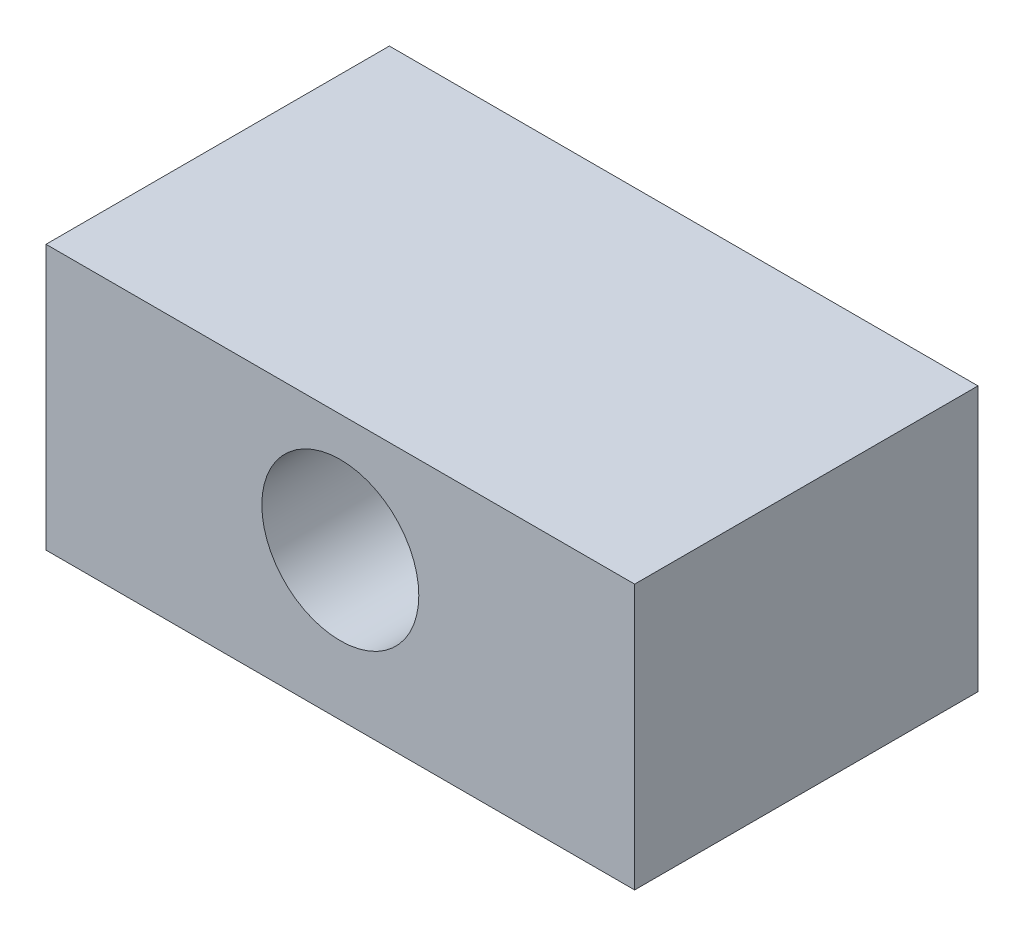
ISO-10303-21;
HEADER;
FILE_DESCRIPTION(('STEP AP214'),'2;1');
FILE_NAME('part.step','',(''),(''),'','','');
FILE_SCHEMA(('AUTOMOTIVE_DESIGN { 1 0 10303 214 1 1 1 1 }'));
ENDSEC;
DATA;
#1=APPLICATION_CONTEXT('core data for automotive mechanical design processes');
#2=APPLICATION_PROTOCOL_DEFINITION('international standard','automotive_design',2000,#1);
#3=PRODUCT_CONTEXT('',#1,'mechanical');
#4=PRODUCT('Part','Part','',(#3));
#5=PRODUCT_RELATED_PRODUCT_CATEGORY('part','',(#4));
#6=PRODUCT_DEFINITION_FORMATION('','',#4);
#7=PRODUCT_DEFINITION_CONTEXT('part definition',#1,'design');
#8=PRODUCT_DEFINITION('design','',#6,#7);
#9=PRODUCT_DEFINITION_SHAPE('','',#8);
#10=(LENGTH_UNIT() NAMED_UNIT(*) SI_UNIT(.MILLI.,.METRE.));
#11=(NAMED_UNIT(*) PLANE_ANGLE_UNIT() SI_UNIT($,.RADIAN.));
#12=(NAMED_UNIT(*) SI_UNIT($,.STERADIAN.) SOLID_ANGLE_UNIT());
#13=UNCERTAINTY_MEASURE_WITH_UNIT(LENGTH_MEASURE(1.E-05),#10,'distance_accuracy_value','');
#14=(GEOMETRIC_REPRESENTATION_CONTEXT(3) GLOBAL_UNCERTAINTY_ASSIGNED_CONTEXT((#13)) GLOBAL_UNIT_ASSIGNED_CONTEXT((#10,
#11,#12)) REPRESENTATION_CONTEXT('',''));
#15=CARTESIAN_POINT('',(0.,0.,0.));
#16=DIRECTION('',(0.,0.,1.));
#17=DIRECTION('',(1.,0.,0.));
#18=AXIS2_PLACEMENT_3D('',#15,#16,#17);
#19=CARTESIAN_POINT('',(0.,3.81,0.));
#20=DIRECTION('',(0.,1.,0.));
#21=DIRECTION('',(0.,0.,1.));
#22=AXIS2_PLACEMENT_3D('',#19,#20,#21);
#23=PLANE('',#22);
#24=DIRECTION('',(0.,0.,1.));
#25=VECTOR('',#24,1.);
#26=CARTESIAN_POINT('',(38.1,3.81,-22.225));
#27=LINE('',#26,#25);
#28=CARTESIAN_POINT('',(38.1,3.81,-22.225));
#29=VERTEX_POINT('',#28);
#30=CARTESIAN_POINT('',(38.1,3.81,22.225));
#31=VERTEX_POINT('',#30);
#32=EDGE_CURVE('E151',#29,#31,#27,.T.);
#33=ORIENTED_EDGE('',*,*,#32,.T.);
#34=DIRECTION('',(-1.,0.,0.));
#35=VECTOR('',#34,1.);
#36=CARTESIAN_POINT('',(-38.1,3.81,22.225));
#37=LINE('',#36,#35);
#38=CARTESIAN_POINT('',(-38.1,3.81,22.225));
#39=VERTEX_POINT('',#38);
#40=EDGE_CURVE('E164',#31,#39,#37,.T.);
#41=ORIENTED_EDGE('',*,*,#40,.T.);
#42=DIRECTION('',(0.,0.,-1.));
#43=VECTOR('',#42,1.);
#44=CARTESIAN_POINT('',(-38.1,3.81,-22.225));
#45=LINE('',#44,#43);
#46=CARTESIAN_POINT('',(-38.1,3.81,-22.225));
#47=VERTEX_POINT('',#46);
#48=EDGE_CURVE('E167',#39,#47,#45,.T.);
#49=ORIENTED_EDGE('',*,*,#48,.T.);
#50=DIRECTION('',(1.,0.,0.));
#51=VECTOR('',#50,1.);
#52=CARTESIAN_POINT('',(-38.1,3.81,-22.225));
#53=LINE('',#52,#51);
#54=EDGE_CURVE('E155',#47,#29,#53,.T.);
#55=ORIENTED_EDGE('',*,*,#54,.T.);
#56=EDGE_LOOP('',(#33,#41,#49,#55));
#57=FACE_BOUND('',#56,.T.);
#58=DIRECTION('',(0.,0.,-1.));
#59=VECTOR('',#58,1.);
#60=CARTESIAN_POINT('',(-25.4,3.81,15.875));
#61=LINE('',#60,#59);
#62=CARTESIAN_POINT('',(-25.4,3.81,15.875));
#63=VERTEX_POINT('',#62);
#64=CARTESIAN_POINT('',(-25.4,3.81,-15.875));
#65=VERTEX_POINT('',#64);
#66=EDGE_CURVE('E115',#63,#65,#61,.T.);
#67=ORIENTED_EDGE('',*,*,#66,.F.);
#68=DIRECTION('',(-1.,0.,0.));
#69=VECTOR('',#68,1.);
#70=CARTESIAN_POINT('',(25.4,3.81,15.875));
#71=LINE('',#70,#69);
#72=CARTESIAN_POINT('',(25.4,3.81,15.875));
#73=VERTEX_POINT('',#72);
#74=EDGE_CURVE('E126',#73,#63,#71,.T.);
#75=ORIENTED_EDGE('',*,*,#74,.F.);
#76=DIRECTION('',(0.,0.,1.));
#77=VECTOR('',#76,1.);
#78=CARTESIAN_POINT('',(25.4,3.81,-15.875));
#79=LINE('',#78,#77);
#80=CARTESIAN_POINT('',(25.4,3.81,-15.875));
#81=VERTEX_POINT('',#80);
#82=EDGE_CURVE('E137',#81,#73,#79,.T.);
#83=ORIENTED_EDGE('',*,*,#82,.F.);
#84=DIRECTION('',(1.,0.,0.));
#85=VECTOR('',#84,1.);
#86=CARTESIAN_POINT('',(-25.4,3.81,-15.875));
#87=LINE('',#86,#85);
#88=EDGE_CURVE('E125',#65,#81,#87,.T.);
#89=ORIENTED_EDGE('',*,*,#88,.F.);
#90=EDGE_LOOP('',(#67,#75,#83,#89));
#91=FACE_BOUND('',#90,.T.);
#92=ADVANCED_FACE('F39',(#57,#91),#23,.F.);
#93=CARTESIAN_POINT('',(38.1,38.1,-22.225));
#94=DIRECTION('',(1.,0.,0.));
#95=DIRECTION('',(0.,0.,-1.));
#96=AXIS2_PLACEMENT_3D('',#93,#94,#95);
#97=PLANE('',#96);
#98=ORIENTED_EDGE('',*,*,#32,.F.);
#99=DIRECTION('',(0.,-1.,0.));
#100=VECTOR('',#99,1.);
#101=CARTESIAN_POINT('',(38.1,38.1,-22.225));
#102=LINE('',#101,#100);
#103=CARTESIAN_POINT('',(38.1,38.1,-22.225));
#104=VERTEX_POINT('',#103);
#105=EDGE_CURVE('E11',#104,#29,#102,.T.);
#106=ORIENTED_EDGE('',*,*,#105,.F.);
#107=DIRECTION('',(0.,0.,1.));
#108=VECTOR('',#107,1.);
#109=CARTESIAN_POINT('',(38.1,38.1,-22.225));
#110=LINE('',#109,#108);
#111=CARTESIAN_POINT('',(38.1,38.1,22.225));
#112=VERTEX_POINT('',#111);
#113=EDGE_CURVE('E152',#104,#112,#110,.T.);
#114=ORIENTED_EDGE('',*,*,#113,.T.);
#115=DIRECTION('',(0.,-1.,0.));
#116=VECTOR('',#115,1.);
#117=CARTESIAN_POINT('',(38.1,38.1,22.225));
#118=LINE('',#117,#116);
#119=EDGE_CURVE('E89',#112,#31,#118,.T.);
#120=ORIENTED_EDGE('',*,*,#119,.T.);
#121=EDGE_LOOP('',(#98,#106,#114,#120));
#122=FACE_BOUND('',#121,.T.);
#123=ADVANCED_FACE('F41',(#122),#97,.T.);
#124=CARTESIAN_POINT('',(-38.1,38.1,-22.225));
#125=DIRECTION('',(0.,0.,-1.));
#126=DIRECTION('',(-1.,0.,0.));
#127=AXIS2_PLACEMENT_3D('',#124,#125,#126);
#128=PLANE('',#127);
#129=CARTESIAN_POINT('',(0.,22.86,-22.225));
#130=DIRECTION('',(0.,0.,-1.));
#131=DIRECTION('',(-1.,0.,0.));
#132=AXIS2_PLACEMENT_3D('',#129,#130,#131);
#133=CIRCLE('',#132,10.16);
#134=CARTESIAN_POINT('',(-10.16,22.86,-22.225));
#135=VERTEX_POINT('',#134);
#136=EDGE_CURVE('E294',#135,#135,#133,.T.);
#137=ORIENTED_EDGE('',*,*,#136,.F.);
#138=EDGE_LOOP('',(#137));
#139=FACE_BOUND('',#138,.T.);
#140=ORIENTED_EDGE('',*,*,#54,.F.);
#141=DIRECTION('',(0.,-1.,0.));
#142=VECTOR('',#141,1.);
#143=CARTESIAN_POINT('',(-38.1,38.1,-22.225));
#144=LINE('',#143,#142);
#145=CARTESIAN_POINT('',(-38.1,38.1,-22.225));
#146=VERTEX_POINT('',#145);
#147=EDGE_CURVE('E48',#146,#47,#144,.T.);
#148=ORIENTED_EDGE('',*,*,#147,.F.);
#149=DIRECTION('',(1.,0.,0.));
#150=VECTOR('',#149,1.);
#151=CARTESIAN_POINT('',(-38.1,38.1,-22.225));
#152=LINE('',#151,#150);
#153=EDGE_CURVE('E160',#146,#104,#152,.T.);
#154=ORIENTED_EDGE('',*,*,#153,.T.);
#155=ORIENTED_EDGE('',*,*,#105,.T.);
#156=EDGE_LOOP('',(#140,#148,#154,#155));
#157=FACE_BOUND('',#156,.T.);
#158=ADVANCED_FACE('F177',(#139,#157),#128,.T.);
#159=CARTESIAN_POINT('',(-38.1,38.1,-22.225));
#160=DIRECTION('',(-1.,0.,0.));
#161=DIRECTION('',(0.,0.,1.));
#162=AXIS2_PLACEMENT_3D('',#159,#160,#161);
#163=PLANE('',#162);
#164=ORIENTED_EDGE('',*,*,#48,.F.);
#165=DIRECTION('',(0.,-1.,0.));
#166=VECTOR('',#165,1.);
#167=CARTESIAN_POINT('',(-38.1,38.1,22.225));
#168=LINE('',#167,#166);
#169=CARTESIAN_POINT('',(-38.1,38.1,22.225));
#170=VERTEX_POINT('',#169);
#171=EDGE_CURVE('E173',#170,#39,#168,.T.);
#172=ORIENTED_EDGE('',*,*,#171,.F.);
#173=DIRECTION('',(0.,0.,-1.));
#174=VECTOR('',#173,1.);
#175=CARTESIAN_POINT('',(-38.1,38.1,-22.225));
#176=LINE('',#175,#174);
#177=EDGE_CURVE('E157',#170,#146,#176,.T.);
#178=ORIENTED_EDGE('',*,*,#177,.T.);
#179=ORIENTED_EDGE('',*,*,#147,.T.);
#180=EDGE_LOOP('',(#164,#172,#178,#179));
#181=FACE_BOUND('',#180,.T.);
#182=ADVANCED_FACE('F181',(#181),#163,.T.);
#183=CARTESIAN_POINT('',(-38.1,38.1,22.225));
#184=DIRECTION('',(0.,0.,1.));
#185=DIRECTION('',(1.,0.,0.));
#186=AXIS2_PLACEMENT_3D('',#183,#184,#185);
#187=PLANE('',#186);
#188=CARTESIAN_POINT('',(0.,22.86,22.225));
#189=DIRECTION('',(0.,0.,1.));
#190=DIRECTION('',(1.,0.,0.));
#191=AXIS2_PLACEMENT_3D('',#188,#189,#190);
#192=CIRCLE('',#191,10.16);
#193=CARTESIAN_POINT('',(10.16,22.86,22.225));
#194=VERTEX_POINT('',#193);
#195=EDGE_CURVE('E43',#194,#194,#192,.T.);
#196=ORIENTED_EDGE('',*,*,#195,.F.);
#197=EDGE_LOOP('',(#196));
#198=FACE_BOUND('',#197,.T.);
#199=ORIENTED_EDGE('',*,*,#40,.F.);
#200=ORIENTED_EDGE('',*,*,#119,.F.);
#201=DIRECTION('',(-1.,0.,0.));
#202=VECTOR('',#201,1.);
#203=CARTESIAN_POINT('',(-38.1,38.1,22.225));
#204=LINE('',#203,#202);
#205=EDGE_CURVE('E154',#112,#170,#204,.T.);
#206=ORIENTED_EDGE('',*,*,#205,.T.);
#207=ORIENTED_EDGE('',*,*,#171,.T.);
#208=EDGE_LOOP('',(#199,#200,#206,#207));
#209=FACE_BOUND('',#208,.T.);
#210=ADVANCED_FACE('F174',(#198,#209),#187,.T.);
#211=CARTESIAN_POINT('',(0.,38.1,0.));
#212=DIRECTION('',(0.,1.,0.));
#213=DIRECTION('',(0.,0.,1.));
#214=AXIS2_PLACEMENT_3D('',#211,#212,#213);
#215=PLANE('',#214);
#216=ORIENTED_EDGE('',*,*,#113,.F.);
#217=ORIENTED_EDGE('',*,*,#153,.F.);
#218=ORIENTED_EDGE('',*,*,#177,.F.);
#219=ORIENTED_EDGE('',*,*,#205,.F.);
#220=EDGE_LOOP('',(#216,#217,#218,#219));
#221=FACE_BOUND('',#220,.T.);
#222=ADVANCED_FACE('F183',(#221),#215,.T.);
#223=CARTESIAN_POINT('',(0.,8.89,0.));
#224=DIRECTION('',(0.,1.,0.));
#225=DIRECTION('',(0.,0.,1.));
#226=AXIS2_PLACEMENT_3D('',#223,#224,#225);
#227=PLANE('',#226);
#228=DIRECTION('',(1.,0.,0.));
#229=VECTOR('',#228,1.);
#230=CARTESIAN_POINT('',(-25.4,8.89,15.875));
#231=LINE('',#230,#229);
#232=CARTESIAN_POINT('',(-25.4,8.89,15.875));
#233=VERTEX_POINT('',#232);
#234=CARTESIAN_POINT('',(25.4,8.89,15.875));
#235=VERTEX_POINT('',#234);
#236=EDGE_CURVE('E138',#233,#235,#231,.T.);
#237=ORIENTED_EDGE('',*,*,#236,.F.);
#238=DIRECTION('',(0.,0.,1.));
#239=VECTOR('',#238,1.);
#240=CARTESIAN_POINT('',(-25.4,8.89,-15.875));
#241=LINE('',#240,#239);
#242=CARTESIAN_POINT('',(-25.4,8.89,-15.875));
#243=VERTEX_POINT('',#242);
#244=EDGE_CURVE('E146',#243,#233,#241,.T.);
#245=ORIENTED_EDGE('',*,*,#244,.F.);
#246=DIRECTION('',(-1.,0.,0.));
#247=VECTOR('',#246,1.);
#248=CARTESIAN_POINT('',(25.4,8.89,-15.875));
#249=LINE('',#248,#247);
#250=CARTESIAN_POINT('',(25.4,8.89,-15.875));
#251=VERTEX_POINT('',#250);
#252=EDGE_CURVE('E133',#251,#243,#249,.T.);
#253=ORIENTED_EDGE('',*,*,#252,.F.);
#254=DIRECTION('',(0.,0.,-1.));
#255=VECTOR('',#254,1.);
#256=CARTESIAN_POINT('',(25.4,8.89,15.875));
#257=LINE('',#256,#255);
#258=EDGE_CURVE('E140',#235,#251,#257,.T.);
#259=ORIENTED_EDGE('',*,*,#258,.F.);
#260=EDGE_LOOP('',(#237,#245,#253,#259));
#261=FACE_BOUND('',#260,.T.);
#262=ADVANCED_FACE('F185',(#261),#227,.F.);
#263=CARTESIAN_POINT('',(-25.4,8.89,15.875));
#264=DIRECTION('',(0.,0.,-1.));
#265=DIRECTION('',(-1.,0.,0.));
#266=AXIS2_PLACEMENT_3D('',#263,#264,#265);
#267=PLANE('',#266);
#268=ORIENTED_EDGE('',*,*,#74,.T.);
#269=DIRECTION('',(0.,-1.,0.));
#270=VECTOR('',#269,1.);
#271=CARTESIAN_POINT('',(-25.4,8.89,15.875));
#272=LINE('',#271,#270);
#273=EDGE_CURVE('E121',#233,#63,#272,.T.);
#274=ORIENTED_EDGE('',*,*,#273,.F.);
#275=ORIENTED_EDGE('',*,*,#236,.T.);
#276=DIRECTION('',(0.,-1.,0.));
#277=VECTOR('',#276,1.);
#278=CARTESIAN_POINT('',(25.4,8.89,15.875));
#279=LINE('',#278,#277);
#280=EDGE_CURVE('E56',#235,#73,#279,.T.);
#281=ORIENTED_EDGE('',*,*,#280,.T.);
#282=EDGE_LOOP('',(#268,#274,#275,#281));
#283=FACE_BOUND('',#282,.T.);
#284=ADVANCED_FACE('F191',(#283),#267,.T.);
#285=CARTESIAN_POINT('',(25.4,8.89,15.875));
#286=DIRECTION('',(-1.,0.,0.));
#287=DIRECTION('',(0.,0.,1.));
#288=AXIS2_PLACEMENT_3D('',#285,#286,#287);
#289=PLANE('',#288);
#290=ORIENTED_EDGE('',*,*,#82,.T.);
#291=ORIENTED_EDGE('',*,*,#280,.F.);
#292=ORIENTED_EDGE('',*,*,#258,.T.);
#293=DIRECTION('',(0.,-1.,0.));
#294=VECTOR('',#293,1.);
#295=CARTESIAN_POINT('',(25.4,8.89,-15.875));
#296=LINE('',#295,#294);
#297=EDGE_CURVE('E134',#251,#81,#296,.T.);
#298=ORIENTED_EDGE('',*,*,#297,.T.);
#299=EDGE_LOOP('',(#290,#291,#292,#298));
#300=FACE_BOUND('',#299,.T.);
#301=ADVANCED_FACE('F242',(#300),#289,.T.);
#302=CARTESIAN_POINT('',(25.4,8.89,-15.875));
#303=DIRECTION('',(0.,0.,1.));
#304=DIRECTION('',(1.,0.,0.));
#305=AXIS2_PLACEMENT_3D('',#302,#303,#304);
#306=PLANE('',#305);
#307=ORIENTED_EDGE('',*,*,#88,.T.);
#308=ORIENTED_EDGE('',*,*,#297,.F.);
#309=ORIENTED_EDGE('',*,*,#252,.T.);
#310=DIRECTION('',(0.,-1.,0.));
#311=VECTOR('',#310,1.);
#312=CARTESIAN_POINT('',(-25.4,8.89,-15.875));
#313=LINE('',#312,#311);
#314=EDGE_CURVE('E118',#243,#65,#313,.T.);
#315=ORIENTED_EDGE('',*,*,#314,.T.);
#316=EDGE_LOOP('',(#307,#308,#309,#315));
#317=FACE_BOUND('',#316,.T.);
#318=ADVANCED_FACE('F129',(#317),#306,.T.);
#319=CARTESIAN_POINT('',(-25.4,8.89,-15.875));
#320=DIRECTION('',(1.,0.,0.));
#321=DIRECTION('',(0.,0.,-1.));
#322=AXIS2_PLACEMENT_3D('',#319,#320,#321);
#323=PLANE('',#322);
#324=ORIENTED_EDGE('',*,*,#66,.T.);
#325=ORIENTED_EDGE('',*,*,#314,.F.);
#326=ORIENTED_EDGE('',*,*,#244,.T.);
#327=ORIENTED_EDGE('',*,*,#273,.T.);
#328=EDGE_LOOP('',(#324,#325,#326,#327));
#329=FACE_BOUND('',#328,.T.);
#330=ADVANCED_FACE('F117',(#329),#323,.T.);
#331=CARTESIAN_POINT('',(0.,22.86,49.911));
#332=DIRECTION('',(0.,0.,-1.));
#333=DIRECTION('',(-1.,0.,0.));
#334=AXIS2_PLACEMENT_3D('',#331,#332,#333);
#335=CYLINDRICAL_SURFACE('',#334,10.16);
#336=ORIENTED_EDGE('',*,*,#195,.T.);
#337=EDGE_LOOP('',(#336));
#338=FACE_BOUND('',#337,.T.);
#339=ORIENTED_EDGE('',*,*,#136,.T.);
#340=EDGE_LOOP('',(#339));
#341=FACE_BOUND('',#340,.T.);
#342=ADVANCED_FACE('F224',(#338,#341),#335,.F.);
#343=CLOSED_SHELL('',(#92,#123,#158,#182,#210,#222,#262,#284,#301,#318,#330,#342));
#344=MANIFOLD_SOLID_BREP('B2',#343);
#345=ADVANCED_BREP_SHAPE_REPRESENTATION('',(#18,#344),#14);
#346=SHAPE_DEFINITION_REPRESENTATION(#9,#345);
ENDSEC;
END-ISO-10303-21;
